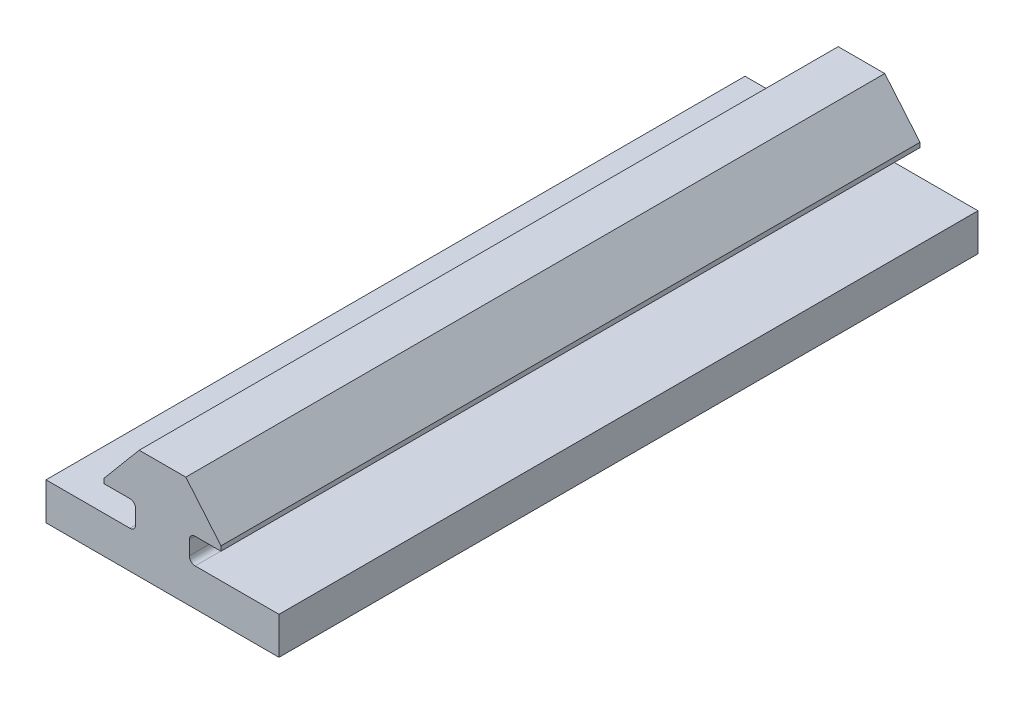
ISO-10303-21;
HEADER;
FILE_DESCRIPTION(('STEP AP214'),'2;1');
FILE_NAME('part.step','',(''),(''),'','','');
FILE_SCHEMA(('AUTOMOTIVE_DESIGN { 1 0 10303 214 1 1 1 1 }'));
ENDSEC;
DATA;
#1=APPLICATION_CONTEXT('core data for automotive mechanical design processes');
#2=APPLICATION_PROTOCOL_DEFINITION('international standard','automotive_design',2000,#1);
#3=PRODUCT_CONTEXT('',#1,'mechanical');
#4=PRODUCT('Part','Part','',(#3));
#5=PRODUCT_RELATED_PRODUCT_CATEGORY('part','',(#4));
#6=PRODUCT_DEFINITION_FORMATION('','',#4);
#7=PRODUCT_DEFINITION_CONTEXT('part definition',#1,'design');
#8=PRODUCT_DEFINITION('design','',#6,#7);
#9=PRODUCT_DEFINITION_SHAPE('','',#8);
#10=(LENGTH_UNIT() NAMED_UNIT(*) SI_UNIT(.MILLI.,.METRE.));
#11=(NAMED_UNIT(*) PLANE_ANGLE_UNIT() SI_UNIT($,.RADIAN.));
#12=(NAMED_UNIT(*) SI_UNIT($,.STERADIAN.) SOLID_ANGLE_UNIT());
#13=UNCERTAINTY_MEASURE_WITH_UNIT(LENGTH_MEASURE(1.E-05),#10,'distance_accuracy_value','');
#14=(GEOMETRIC_REPRESENTATION_CONTEXT(3) GLOBAL_UNCERTAINTY_ASSIGNED_CONTEXT((#13)) GLOBAL_UNIT_ASSIGNED_CONTEXT((#10,
#11,#12)) REPRESENTATION_CONTEXT('',''));
#15=CARTESIAN_POINT('',(0.,0.,0.));
#16=DIRECTION('',(0.,0.,1.));
#17=DIRECTION('',(1.,0.,0.));
#18=AXIS2_PLACEMENT_3D('',#15,#16,#17);
#19=CARTESIAN_POINT('',(-12.7,0.,-3759.2));
#20=DIRECTION('',(1.,0.,0.));
#21=DIRECTION('',(0.,0.,-1.));
#22=AXIS2_PLACEMENT_3D('',#19,#20,#21);
#23=PLANE('',#22);
#24=DIRECTION('',(0.,1.,0.));
#25=VECTOR('',#24,1.);
#26=CARTESIAN_POINT('',(-12.7,0.,-3683.));
#27=LINE('',#26,#25);
#28=CARTESIAN_POINT('',(-12.7,0.,-3683.));
#29=VERTEX_POINT('',#28);
#30=CARTESIAN_POINT('',(-12.7,4.064,-3683.));
#31=VERTEX_POINT('',#30);
#32=EDGE_CURVE('E189',#29,#31,#27,.T.);
#33=ORIENTED_EDGE('',*,*,#32,.T.);
#34=DIRECTION('',(0.,0.,1.));
#35=VECTOR('',#34,1.);
#36=CARTESIAN_POINT('',(-12.7,4.064,-3759.2));
#37=LINE('',#36,#35);
#38=CARTESIAN_POINT('',(-12.7,4.064,-3759.2));
#39=VERTEX_POINT('',#38);
#40=EDGE_CURVE('E11',#39,#31,#37,.T.);
#41=ORIENTED_EDGE('',*,*,#40,.F.);
#42=DIRECTION('',(0.,1.,0.));
#43=VECTOR('',#42,1.);
#44=CARTESIAN_POINT('',(-12.7,0.,-3759.2));
#45=LINE('',#44,#43);
#46=CARTESIAN_POINT('',(-12.7,0.,-3759.2));
#47=VERTEX_POINT('',#46);
#48=EDGE_CURVE('E223',#47,#39,#45,.T.);
#49=ORIENTED_EDGE('',*,*,#48,.F.);
#50=DIRECTION('',(0.,0.,1.));
#51=VECTOR('',#50,1.);
#52=CARTESIAN_POINT('',(-12.7,0.,-3759.2));
#53=LINE('',#52,#51);
#54=EDGE_CURVE('E185',#47,#29,#53,.T.);
#55=ORIENTED_EDGE('',*,*,#54,.T.);
#56=EDGE_LOOP('',(#33,#41,#49,#55));
#57=FACE_BOUND('',#56,.T.);
#58=ADVANCED_FACE('F33',(#57),#23,.F.);
#59=CARTESIAN_POINT('',(-12.7,4.064,-3759.2));
#60=DIRECTION('',(0.,-1.,0.));
#61=DIRECTION('',(0.,0.,-1.));
#62=AXIS2_PLACEMENT_3D('',#59,#60,#61);
#63=PLANE('',#62);
#64=DIRECTION('',(1.,0.,0.));
#65=VECTOR('',#64,1.);
#66=CARTESIAN_POINT('',(-12.7,4.064,-3683.));
#67=LINE('',#66,#65);
#68=CARTESIAN_POINT('',(-3.55599999999985,4.064,-3683.));
#69=VERTEX_POINT('',#68);
#70=EDGE_CURVE('E192',#31,#69,#67,.T.);
#71=ORIENTED_EDGE('',*,*,#70,.T.);
#72=DIRECTION('',(0.,0.,1.));
#73=VECTOR('',#72,1.);
#74=CARTESIAN_POINT('',(-3.55599999999985,4.064,-3759.2));
#75=LINE('',#74,#73);
#76=CARTESIAN_POINT('',(-3.55599999999985,4.064,-3759.2));
#77=VERTEX_POINT('',#76);
#78=EDGE_CURVE('E41',#77,#69,#75,.T.);
#79=ORIENTED_EDGE('',*,*,#78,.F.);
#80=DIRECTION('',(1.,0.,0.));
#81=VECTOR('',#80,1.);
#82=CARTESIAN_POINT('',(-12.7,4.064,-3759.2));
#83=LINE('',#82,#81);
#84=EDGE_CURVE('E122',#39,#77,#83,.T.);
#85=ORIENTED_EDGE('',*,*,#84,.F.);
#86=ORIENTED_EDGE('',*,*,#40,.T.);
#87=EDGE_LOOP('',(#71,#79,#85,#86));
#88=FACE_BOUND('',#87,.T.);
#89=ADVANCED_FACE('F331',(#88),#63,.F.);
#90=CARTESIAN_POINT('',(-3.55599999999985,4.69899999999985,-3759.2));
#91=DIRECTION('',(0.,0.,1.));
#92=DIRECTION('',(1.,0.,0.));
#93=AXIS2_PLACEMENT_3D('',#90,#91,#92);
#94=CYLINDRICAL_SURFACE('',#93,0.634999999999851);
#95=CARTESIAN_POINT('',(-3.55599999999985,4.69899999999985,-3683.));
#96=DIRECTION('',(0.,0.,1.));
#97=DIRECTION('',(1.,0.,0.));
#98=AXIS2_PLACEMENT_3D('',#95,#96,#97);
#99=CIRCLE('',#98,0.634999999999851);
#100=CARTESIAN_POINT('',(-2.921,4.69899999999985,-3683.));
#101=VERTEX_POINT('',#100);
#102=EDGE_CURVE('E194',#69,#101,#99,.T.);
#103=ORIENTED_EDGE('',*,*,#102,.T.);
#104=DIRECTION('',(0.,0.,1.));
#105=VECTOR('',#104,1.);
#106=CARTESIAN_POINT('',(-2.921,4.69899999999985,-3759.2));
#107=LINE('',#106,#105);
#108=CARTESIAN_POINT('',(-2.921,4.69899999999985,-3759.2));
#109=VERTEX_POINT('',#108);
#110=EDGE_CURVE('E260',#109,#101,#107,.T.);
#111=ORIENTED_EDGE('',*,*,#110,.F.);
#112=CARTESIAN_POINT('',(-3.55599999999985,4.69899999999985,-3759.2));
#113=DIRECTION('',(0.,0.,1.));
#114=DIRECTION('',(1.,0.,0.));
#115=AXIS2_PLACEMENT_3D('',#112,#113,#114);
#116=CIRCLE('',#115,0.634999999999851);
#117=EDGE_CURVE('E268',#77,#109,#116,.T.);
#118=ORIENTED_EDGE('',*,*,#117,.F.);
#119=ORIENTED_EDGE('',*,*,#78,.T.);
#120=EDGE_LOOP('',(#103,#111,#118,#119));
#121=FACE_BOUND('',#120,.T.);
#122=ADVANCED_FACE('F266',(#121),#94,.F.);
#123=CARTESIAN_POINT('',(-2.92099999999999,4.69899999999985,-3759.2));
#124=DIRECTION('',(1.,0.,0.));
#125=DIRECTION('',(0.,1.,0.));
#126=AXIS2_PLACEMENT_3D('',#123,#124,#125);
#127=PLANE('',#126);
#128=DIRECTION('',(0.,1.,0.));
#129=VECTOR('',#128,1.);
#130=CARTESIAN_POINT('',(-2.92099999999999,4.69899999999985,-3683.));
#131=LINE('',#130,#129);
#132=CARTESIAN_POINT('',(-2.921,6.22300000000015,-3683.));
#133=VERTEX_POINT('',#132);
#134=EDGE_CURVE('E196',#101,#133,#131,.T.);
#135=ORIENTED_EDGE('',*,*,#134,.T.);
#136=DIRECTION('',(0.,0.,1.));
#137=VECTOR('',#136,1.);
#138=CARTESIAN_POINT('',(-2.921,6.22300000000015,-3759.2));
#139=LINE('',#138,#137);
#140=CARTESIAN_POINT('',(-2.921,6.22300000000015,-3759.2));
#141=VERTEX_POINT('',#140);
#142=EDGE_CURVE('E257',#141,#133,#139,.T.);
#143=ORIENTED_EDGE('',*,*,#142,.F.);
#144=DIRECTION('',(0.,1.,0.));
#145=VECTOR('',#144,1.);
#146=CARTESIAN_POINT('',(-2.92099999999999,4.69899999999985,-3759.2));
#147=LINE('',#146,#145);
#148=EDGE_CURVE('E286',#109,#141,#147,.T.);
#149=ORIENTED_EDGE('',*,*,#148,.F.);
#150=ORIENTED_EDGE('',*,*,#110,.T.);
#151=EDGE_LOOP('',(#135,#143,#149,#150));
#152=FACE_BOUND('',#151,.T.);
#153=ADVANCED_FACE('F277',(#152),#127,.F.);
#154=CARTESIAN_POINT('',(-3.55599999999985,6.22300000000015,-3759.2));
#155=DIRECTION('',(0.,0.,1.));
#156=DIRECTION('',(1.,0.,0.));
#157=AXIS2_PLACEMENT_3D('',#154,#155,#156);
#158=CYLINDRICAL_SURFACE('',#157,0.634999999999851);
#159=CARTESIAN_POINT('',(-3.55599999999985,6.22300000000015,-3683.));
#160=DIRECTION('',(0.,0.,1.));
#161=DIRECTION('',(1.,0.,0.));
#162=AXIS2_PLACEMENT_3D('',#159,#160,#161);
#163=CIRCLE('',#162,0.634999999999851);
#164=CARTESIAN_POINT('',(-3.55599999999985,6.858,-3683.));
#165=VERTEX_POINT('',#164);
#166=EDGE_CURVE('E198',#133,#165,#163,.T.);
#167=ORIENTED_EDGE('',*,*,#166,.T.);
#168=DIRECTION('',(0.,0.,1.));
#169=VECTOR('',#168,1.);
#170=CARTESIAN_POINT('',(-3.55599999999985,6.858,-3759.2));
#171=LINE('',#170,#169);
#172=CARTESIAN_POINT('',(-3.55599999999985,6.858,-3759.2));
#173=VERTEX_POINT('',#172);
#174=EDGE_CURVE('E254',#173,#165,#171,.T.);
#175=ORIENTED_EDGE('',*,*,#174,.F.);
#176=CARTESIAN_POINT('',(-3.55599999999985,6.22300000000015,-3759.2));
#177=DIRECTION('',(0.,0.,1.));
#178=DIRECTION('',(1.,0.,0.));
#179=AXIS2_PLACEMENT_3D('',#176,#177,#178);
#180=CIRCLE('',#179,0.634999999999851);
#181=EDGE_CURVE('E283',#141,#173,#180,.T.);
#182=ORIENTED_EDGE('',*,*,#181,.F.);
#183=ORIENTED_EDGE('',*,*,#142,.T.);
#184=EDGE_LOOP('',(#167,#175,#182,#183));
#185=FACE_BOUND('',#184,.T.);
#186=ADVANCED_FACE('F281',(#185),#158,.F.);
#187=CARTESIAN_POINT('',(-3.55599999999985,6.85800000000001,-3759.2));
#188=DIRECTION('',(0.,1.,0.));
#189=DIRECTION('',(-1.,0.,0.));
#190=AXIS2_PLACEMENT_3D('',#187,#188,#189);
#191=PLANE('',#190);
#192=DIRECTION('',(-1.,0.,0.));
#193=VECTOR('',#192,1.);
#194=CARTESIAN_POINT('',(-3.55599999999985,6.85800000000001,-3683.));
#195=LINE('',#194,#193);
#196=CARTESIAN_POINT('',(-6.376363549,6.858,-3683.));
#197=VERTEX_POINT('',#196);
#198=EDGE_CURVE('E200',#165,#197,#195,.T.);
#199=ORIENTED_EDGE('',*,*,#198,.T.);
#200=DIRECTION('',(0.,0.,1.));
#201=VECTOR('',#200,1.);
#202=CARTESIAN_POINT('',(-6.376363549,6.858,-3759.2));
#203=LINE('',#202,#201);
#204=CARTESIAN_POINT('',(-6.376363549,6.858,-3759.2));
#205=VERTEX_POINT('',#204);
#206=EDGE_CURVE('E251',#205,#197,#203,.T.);
#207=ORIENTED_EDGE('',*,*,#206,.F.);
#208=DIRECTION('',(-1.,0.,0.));
#209=VECTOR('',#208,1.);
#210=CARTESIAN_POINT('',(-3.55599999999985,6.85800000000001,-3759.2));
#211=LINE('',#210,#209);
#212=EDGE_CURVE('E285',#173,#205,#211,.T.);
#213=ORIENTED_EDGE('',*,*,#212,.F.);
#214=ORIENTED_EDGE('',*,*,#174,.T.);
#215=EDGE_LOOP('',(#199,#207,#213,#214));
#216=FACE_BOUND('',#215,.T.);
#217=ADVANCED_FACE('F344',(#216),#191,.F.);
#218=CARTESIAN_POINT('',(-6.376363549,6.858,-3759.2));
#219=DIRECTION('',(1.,0.,0.));
#220=DIRECTION('',(0.,0.,-1.));
#221=AXIS2_PLACEMENT_3D('',#218,#219,#220);
#222=PLANE('',#221);
#223=DIRECTION('',(0.,1.,0.));
#224=VECTOR('',#223,1.);
#225=CARTESIAN_POINT('',(-6.376363549,6.858,-3683.));
#226=LINE('',#225,#224);
#227=CARTESIAN_POINT('',(-6.376363549,7.36599995798179,-3683.));
#228=VERTEX_POINT('',#227);
#229=EDGE_CURVE('E202',#197,#228,#226,.T.);
#230=ORIENTED_EDGE('',*,*,#229,.T.);
#231=DIRECTION('',(0.,0.,1.));
#232=VECTOR('',#231,1.);
#233=CARTESIAN_POINT('',(-6.376363549,7.36599995798179,-3759.2));
#234=LINE('',#233,#232);
#235=CARTESIAN_POINT('',(-6.376363549,7.36599995798179,-3759.2));
#236=VERTEX_POINT('',#235);
#237=EDGE_CURVE('E248',#236,#228,#234,.T.);
#238=ORIENTED_EDGE('',*,*,#237,.F.);
#239=DIRECTION('',(0.,1.,0.));
#240=VECTOR('',#239,1.);
#241=CARTESIAN_POINT('',(-6.376363549,6.858,-3759.2));
#242=LINE('',#241,#240);
#243=EDGE_CURVE('E288',#205,#236,#242,.T.);
#244=ORIENTED_EDGE('',*,*,#243,.F.);
#245=ORIENTED_EDGE('',*,*,#206,.T.);
#246=EDGE_LOOP('',(#230,#238,#244,#245));
#247=FACE_BOUND('',#246,.T.);
#248=ADVANCED_FACE('F347',(#247),#222,.F.);
#249=CARTESIAN_POINT('',(-6.376363549,7.36599995798179,-3759.2));
#250=DIRECTION('',(0.766044443118977,-0.642787609686541,0.));
#251=DIRECTION('',(0.642787609686541,0.766044443118977,0.));
#252=AXIS2_PLACEMENT_3D('',#249,#250,#251);
#253=PLANE('',#252);
#254=DIRECTION('',(0.642787609686541,0.766044443118977,0.));
#255=VECTOR('',#254,1.);
#256=CARTESIAN_POINT('',(-6.376363549,7.36599995798179,-3683.));
#257=LINE('',#256,#255);
#258=CARTESIAN_POINT('',(-2.54,11.938,-3683.));
#259=VERTEX_POINT('',#258);
#260=EDGE_CURVE('E204',#228,#259,#257,.T.);
#261=ORIENTED_EDGE('',*,*,#260,.T.);
#262=DIRECTION('',(0.,0.,1.));
#263=VECTOR('',#262,1.);
#264=CARTESIAN_POINT('',(-2.54,11.938,-3759.2));
#265=LINE('',#264,#263);
#266=CARTESIAN_POINT('',(-2.54,11.938,-3759.2));
#267=VERTEX_POINT('',#266);
#268=EDGE_CURVE('E245',#267,#259,#265,.T.);
#269=ORIENTED_EDGE('',*,*,#268,.F.);
#270=DIRECTION('',(0.642787609686541,0.766044443118977,0.));
#271=VECTOR('',#270,1.);
#272=CARTESIAN_POINT('',(-6.376363549,7.36599995798179,-3759.2));
#273=LINE('',#272,#271);
#274=EDGE_CURVE('E294',#236,#267,#273,.T.);
#275=ORIENTED_EDGE('',*,*,#274,.F.);
#276=ORIENTED_EDGE('',*,*,#237,.T.);
#277=EDGE_LOOP('',(#261,#269,#275,#276));
#278=FACE_BOUND('',#277,.T.);
#279=ADVANCED_FACE('F351',(#278),#253,.F.);
#280=CARTESIAN_POINT('',(-2.54,11.938,-3759.2));
#281=DIRECTION('',(0.,-1.,0.));
#282=DIRECTION('',(0.,0.,-1.));
#283=AXIS2_PLACEMENT_3D('',#280,#281,#282);
#284=PLANE('',#283);
#285=DIRECTION('',(1.,0.,0.));
#286=VECTOR('',#285,1.);
#287=CARTESIAN_POINT('',(-2.54,11.938,-3683.));
#288=LINE('',#287,#286);
#289=CARTESIAN_POINT('',(2.54,11.938,-3683.));
#290=VERTEX_POINT('',#289);
#291=EDGE_CURVE('E206',#259,#290,#288,.T.);
#292=ORIENTED_EDGE('',*,*,#291,.T.);
#293=DIRECTION('',(0.,0.,1.));
#294=VECTOR('',#293,1.);
#295=CARTESIAN_POINT('',(2.54,11.938,-3759.2));
#296=LINE('',#295,#294);
#297=CARTESIAN_POINT('',(2.54,11.938,-3759.2));
#298=VERTEX_POINT('',#297);
#299=EDGE_CURVE('E242',#298,#290,#296,.T.);
#300=ORIENTED_EDGE('',*,*,#299,.F.);
#301=DIRECTION('',(1.,0.,0.));
#302=VECTOR('',#301,1.);
#303=CARTESIAN_POINT('',(-2.54,11.938,-3759.2));
#304=LINE('',#303,#302);
#305=EDGE_CURVE('E296',#267,#298,#304,.T.);
#306=ORIENTED_EDGE('',*,*,#305,.F.);
#307=ORIENTED_EDGE('',*,*,#268,.T.);
#308=EDGE_LOOP('',(#292,#300,#306,#307));
#309=FACE_BOUND('',#308,.T.);
#310=ADVANCED_FACE('F355',(#309),#284,.F.);
#311=CARTESIAN_POINT('',(2.54,11.938,-3759.2));
#312=DIRECTION('',(-0.766044443118977,-0.642787609686541,0.));
#313=DIRECTION('',(0.642787609686541,-0.766044443118977,0.));
#314=AXIS2_PLACEMENT_3D('',#311,#312,#313);
#315=PLANE('',#314);
#316=DIRECTION('',(0.642787609686541,-0.766044443118977,0.));
#317=VECTOR('',#316,1.);
#318=CARTESIAN_POINT('',(2.54,11.938,-3683.));
#319=LINE('',#318,#317);
#320=CARTESIAN_POINT('',(6.376363549,7.36599995798179,-3683.));
#321=VERTEX_POINT('',#320);
#322=EDGE_CURVE('E208',#290,#321,#319,.T.);
#323=ORIENTED_EDGE('',*,*,#322,.T.);
#324=DIRECTION('',(0.,0.,1.));
#325=VECTOR('',#324,1.);
#326=CARTESIAN_POINT('',(6.376363549,7.36599995798179,-3759.2));
#327=LINE('',#326,#325);
#328=CARTESIAN_POINT('',(6.376363549,7.36599995798179,-3759.2));
#329=VERTEX_POINT('',#328);
#330=EDGE_CURVE('E239',#329,#321,#327,.T.);
#331=ORIENTED_EDGE('',*,*,#330,.F.);
#332=DIRECTION('',(0.642787609686541,-0.766044443118977,0.));
#333=VECTOR('',#332,1.);
#334=CARTESIAN_POINT('',(2.54,11.938,-3759.2));
#335=LINE('',#334,#333);
#336=EDGE_CURVE('E298',#298,#329,#335,.T.);
#337=ORIENTED_EDGE('',*,*,#336,.F.);
#338=ORIENTED_EDGE('',*,*,#299,.T.);
#339=EDGE_LOOP('',(#323,#331,#337,#338));
#340=FACE_BOUND('',#339,.T.);
#341=ADVANCED_FACE('F359',(#340),#315,.F.);
#342=CARTESIAN_POINT('',(6.376363549,7.36599995798179,-3759.2));
#343=DIRECTION('',(-1.,0.,0.));
#344=DIRECTION('',(0.,0.,1.));
#345=AXIS2_PLACEMENT_3D('',#342,#343,#344);
#346=PLANE('',#345);
#347=DIRECTION('',(0.,-1.,0.));
#348=VECTOR('',#347,1.);
#349=CARTESIAN_POINT('',(6.376363549,7.36599995798179,-3683.));
#350=LINE('',#349,#348);
#351=CARTESIAN_POINT('',(6.376363549,6.858,-3683.));
#352=VERTEX_POINT('',#351);
#353=EDGE_CURVE('E210',#321,#352,#350,.T.);
#354=ORIENTED_EDGE('',*,*,#353,.T.);
#355=DIRECTION('',(0.,0.,1.));
#356=VECTOR('',#355,1.);
#357=CARTESIAN_POINT('',(6.376363549,6.858,-3759.2));
#358=LINE('',#357,#356);
#359=CARTESIAN_POINT('',(6.376363549,6.858,-3759.2));
#360=VERTEX_POINT('',#359);
#361=EDGE_CURVE('E236',#360,#352,#358,.T.);
#362=ORIENTED_EDGE('',*,*,#361,.F.);
#363=DIRECTION('',(0.,-1.,0.));
#364=VECTOR('',#363,1.);
#365=CARTESIAN_POINT('',(6.376363549,7.36599995798179,-3759.2));
#366=LINE('',#365,#364);
#367=EDGE_CURVE('E300',#329,#360,#366,.T.);
#368=ORIENTED_EDGE('',*,*,#367,.F.);
#369=ORIENTED_EDGE('',*,*,#330,.T.);
#370=EDGE_LOOP('',(#354,#362,#368,#369));
#371=FACE_BOUND('',#370,.T.);
#372=ADVANCED_FACE('F363',(#371),#346,.F.);
#373=CARTESIAN_POINT('',(6.376363549,6.858,-3759.2));
#374=DIRECTION('',(0.,1.,0.));
#375=DIRECTION('',(0.,0.,1.));
#376=AXIS2_PLACEMENT_3D('',#373,#374,#375);
#377=PLANE('',#376);
#378=DIRECTION('',(-1.,0.,0.));
#379=VECTOR('',#378,1.);
#380=CARTESIAN_POINT('',(6.376363549,6.858,-3683.));
#381=LINE('',#380,#379);
#382=CARTESIAN_POINT('',(3.55599999999985,6.858,-3683.));
#383=VERTEX_POINT('',#382);
#384=EDGE_CURVE('E212',#352,#383,#381,.T.);
#385=ORIENTED_EDGE('',*,*,#384,.T.);
#386=DIRECTION('',(0.,0.,1.));
#387=VECTOR('',#386,1.);
#388=CARTESIAN_POINT('',(3.55599999999985,6.858,-3759.2));
#389=LINE('',#388,#387);
#390=CARTESIAN_POINT('',(3.55599999999985,6.858,-3759.2));
#391=VERTEX_POINT('',#390);
#392=EDGE_CURVE('E233',#391,#383,#389,.T.);
#393=ORIENTED_EDGE('',*,*,#392,.F.);
#394=DIRECTION('',(-1.,0.,0.));
#395=VECTOR('',#394,1.);
#396=CARTESIAN_POINT('',(6.376363549,6.858,-3759.2));
#397=LINE('',#396,#395);
#398=EDGE_CURVE('E302',#360,#391,#397,.T.);
#399=ORIENTED_EDGE('',*,*,#398,.F.);
#400=ORIENTED_EDGE('',*,*,#361,.T.);
#401=EDGE_LOOP('',(#385,#393,#399,#400));
#402=FACE_BOUND('',#401,.T.);
#403=ADVANCED_FACE('F367',(#402),#377,.F.);
#404=CARTESIAN_POINT('',(3.55599999999985,6.22300000000015,-3759.2));
#405=DIRECTION('',(0.,0.,1.));
#406=DIRECTION('',(1.,0.,0.));
#407=AXIS2_PLACEMENT_3D('',#404,#405,#406);
#408=CYLINDRICAL_SURFACE('',#407,0.634999999999851);
#409=CARTESIAN_POINT('',(3.55599999999985,6.22300000000015,-3683.));
#410=DIRECTION('',(0.,0.,1.));
#411=DIRECTION('',(1.,0.,0.));
#412=AXIS2_PLACEMENT_3D('',#409,#410,#411);
#413=CIRCLE('',#412,0.634999999999851);
#414=CARTESIAN_POINT('',(2.921,6.22300000000015,-3683.));
#415=VERTEX_POINT('',#414);
#416=EDGE_CURVE('E214',#383,#415,#413,.T.);
#417=ORIENTED_EDGE('',*,*,#416,.T.);
#418=DIRECTION('',(0.,0.,1.));
#419=VECTOR('',#418,1.);
#420=CARTESIAN_POINT('',(2.921,6.22300000000015,-3759.2));
#421=LINE('',#420,#419);
#422=CARTESIAN_POINT('',(2.921,6.22300000000015,-3759.2));
#423=VERTEX_POINT('',#422);
#424=EDGE_CURVE('E230',#423,#415,#421,.T.);
#425=ORIENTED_EDGE('',*,*,#424,.F.);
#426=CARTESIAN_POINT('',(3.55599999999985,6.22300000000015,-3759.2));
#427=DIRECTION('',(0.,0.,1.));
#428=DIRECTION('',(1.,0.,0.));
#429=AXIS2_PLACEMENT_3D('',#426,#427,#428);
#430=CIRCLE('',#429,0.634999999999851);
#431=EDGE_CURVE('E304',#391,#423,#430,.T.);
#432=ORIENTED_EDGE('',*,*,#431,.F.);
#433=ORIENTED_EDGE('',*,*,#392,.T.);
#434=EDGE_LOOP('',(#417,#425,#432,#433));
#435=FACE_BOUND('',#434,.T.);
#436=ADVANCED_FACE('F371',(#435),#408,.F.);
#437=CARTESIAN_POINT('',(2.92099999999999,6.22300000000015,-3759.2));
#438=DIRECTION('',(-1.,0.,0.));
#439=DIRECTION('',(0.,-1.,0.));
#440=AXIS2_PLACEMENT_3D('',#437,#438,#439);
#441=PLANE('',#440);
#442=DIRECTION('',(0.,-1.,0.));
#443=VECTOR('',#442,1.);
#444=CARTESIAN_POINT('',(2.92099999999999,6.22300000000015,-3683.));
#445=LINE('',#444,#443);
#446=CARTESIAN_POINT('',(2.921,4.69899999999985,-3683.));
#447=VERTEX_POINT('',#446);
#448=EDGE_CURVE('E216',#415,#447,#445,.T.);
#449=ORIENTED_EDGE('',*,*,#448,.T.);
#450=DIRECTION('',(0.,0.,1.));
#451=VECTOR('',#450,1.);
#452=CARTESIAN_POINT('',(2.921,4.69899999999985,-3759.2));
#453=LINE('',#452,#451);
#454=CARTESIAN_POINT('',(2.921,4.69899999999985,-3759.2));
#455=VERTEX_POINT('',#454);
#456=EDGE_CURVE('E227',#455,#447,#453,.T.);
#457=ORIENTED_EDGE('',*,*,#456,.F.);
#458=DIRECTION('',(0.,-1.,0.));
#459=VECTOR('',#458,1.);
#460=CARTESIAN_POINT('',(2.92099999999999,6.22300000000015,-3759.2));
#461=LINE('',#460,#459);
#462=EDGE_CURVE('E306',#423,#455,#461,.T.);
#463=ORIENTED_EDGE('',*,*,#462,.F.);
#464=ORIENTED_EDGE('',*,*,#424,.T.);
#465=EDGE_LOOP('',(#449,#457,#463,#464));
#466=FACE_BOUND('',#465,.T.);
#467=ADVANCED_FACE('F312',(#466),#441,.F.);
#468=CARTESIAN_POINT('',(3.55599999999985,4.69899999999985,-3759.2));
#469=DIRECTION('',(0.,0.,1.));
#470=DIRECTION('',(1.,0.,0.));
#471=AXIS2_PLACEMENT_3D('',#468,#469,#470);
#472=CYLINDRICAL_SURFACE('',#471,0.634999999999851);
#473=CARTESIAN_POINT('',(3.55599999999985,4.69899999999985,-3683.));
#474=DIRECTION('',(0.,0.,1.));
#475=DIRECTION('',(1.,0.,0.));
#476=AXIS2_PLACEMENT_3D('',#473,#474,#475);
#477=CIRCLE('',#476,0.634999999999851);
#478=CARTESIAN_POINT('',(3.55599999999985,4.064,-3683.));
#479=VERTEX_POINT('',#478);
#480=EDGE_CURVE('E218',#447,#479,#477,.T.);
#481=ORIENTED_EDGE('',*,*,#480,.T.);
#482=DIRECTION('',(0.,0.,1.));
#483=VECTOR('',#482,1.);
#484=CARTESIAN_POINT('',(3.55599999999985,4.064,-3759.2));
#485=LINE('',#484,#483);
#486=CARTESIAN_POINT('',(3.55599999999985,4.064,-3759.2));
#487=VERTEX_POINT('',#486);
#488=EDGE_CURVE('E180',#487,#479,#485,.T.);
#489=ORIENTED_EDGE('',*,*,#488,.F.);
#490=CARTESIAN_POINT('',(3.55599999999985,4.69899999999985,-3759.2));
#491=DIRECTION('',(0.,0.,1.));
#492=DIRECTION('',(1.,0.,0.));
#493=AXIS2_PLACEMENT_3D('',#490,#491,#492);
#494=CIRCLE('',#493,0.634999999999851);
#495=EDGE_CURVE('E171',#455,#487,#494,.T.);
#496=ORIENTED_EDGE('',*,*,#495,.F.);
#497=ORIENTED_EDGE('',*,*,#456,.T.);
#498=EDGE_LOOP('',(#481,#489,#496,#497));
#499=FACE_BOUND('',#498,.T.);
#500=ADVANCED_FACE('F316',(#499),#472,.F.);
#501=CARTESIAN_POINT('',(3.55599999999985,4.06399999999999,-3759.2));
#502=DIRECTION('',(0.,-1.,0.));
#503=DIRECTION('',(1.,0.,0.));
#504=AXIS2_PLACEMENT_3D('',#501,#502,#503);
#505=PLANE('',#504);
#506=DIRECTION('',(1.,0.,0.));
#507=VECTOR('',#506,1.);
#508=CARTESIAN_POINT('',(3.55599999999985,4.06399999999999,-3683.));
#509=LINE('',#508,#507);
#510=CARTESIAN_POINT('',(12.7,4.064,-3683.));
#511=VERTEX_POINT('',#510);
#512=EDGE_CURVE('E179',#479,#511,#509,.T.);
#513=ORIENTED_EDGE('',*,*,#512,.T.);
#514=DIRECTION('',(0.,0.,1.));
#515=VECTOR('',#514,1.);
#516=CARTESIAN_POINT('',(12.7,4.064,-3759.2));
#517=LINE('',#516,#515);
#518=CARTESIAN_POINT('',(12.7,4.064,-3759.2));
#519=VERTEX_POINT('',#518);
#520=EDGE_CURVE('E176',#519,#511,#517,.T.);
#521=ORIENTED_EDGE('',*,*,#520,.F.);
#522=DIRECTION('',(1.,0.,0.));
#523=VECTOR('',#522,1.);
#524=CARTESIAN_POINT('',(3.55599999999985,4.06399999999999,-3759.2));
#525=LINE('',#524,#523);
#526=EDGE_CURVE('E165',#487,#519,#525,.T.);
#527=ORIENTED_EDGE('',*,*,#526,.F.);
#528=ORIENTED_EDGE('',*,*,#488,.T.);
#529=EDGE_LOOP('',(#513,#521,#527,#528));
#530=FACE_BOUND('',#529,.T.);
#531=ADVANCED_FACE('F177',(#530),#505,.F.);
#532=CARTESIAN_POINT('',(12.7,4.064,-3759.2));
#533=DIRECTION('',(-1.,0.,0.));
#534=DIRECTION('',(0.,0.,1.));
#535=AXIS2_PLACEMENT_3D('',#532,#533,#534);
#536=PLANE('',#535);
#537=DIRECTION('',(0.,-1.,0.));
#538=VECTOR('',#537,1.);
#539=CARTESIAN_POINT('',(12.7,4.064,-3683.));
#540=LINE('',#539,#538);
#541=CARTESIAN_POINT('',(12.7,0.,-3683.));
#542=VERTEX_POINT('',#541);
#543=EDGE_CURVE('E108',#511,#542,#540,.T.);
#544=ORIENTED_EDGE('',*,*,#543,.T.);
#545=DIRECTION('',(0.,0.,1.));
#546=VECTOR('',#545,1.);
#547=CARTESIAN_POINT('',(12.7,0.,-3759.2));
#548=LINE('',#547,#546);
#549=CARTESIAN_POINT('',(12.7,0.,-3759.2));
#550=VERTEX_POINT('',#549);
#551=EDGE_CURVE('E181',#550,#542,#548,.T.);
#552=ORIENTED_EDGE('',*,*,#551,.F.);
#553=DIRECTION('',(0.,-1.,0.));
#554=VECTOR('',#553,1.);
#555=CARTESIAN_POINT('',(12.7,4.064,-3759.2));
#556=LINE('',#555,#554);
#557=EDGE_CURVE('E169',#519,#550,#556,.T.);
#558=ORIENTED_EDGE('',*,*,#557,.F.);
#559=ORIENTED_EDGE('',*,*,#520,.T.);
#560=EDGE_LOOP('',(#544,#552,#558,#559));
#561=FACE_BOUND('',#560,.T.);
#562=ADVANCED_FACE('F183',(#561),#536,.F.);
#563=CARTESIAN_POINT('',(12.7,0.,-3759.2));
#564=DIRECTION('',(0.,1.,0.));
#565=DIRECTION('',(0.,0.,1.));
#566=AXIS2_PLACEMENT_3D('',#563,#564,#565);
#567=PLANE('',#566);
#568=DIRECTION('',(-1.,0.,0.));
#569=VECTOR('',#568,1.);
#570=CARTESIAN_POINT('',(12.7,0.,-3683.));
#571=LINE('',#570,#569);
#572=EDGE_CURVE('E114',#542,#29,#571,.T.);
#573=ORIENTED_EDGE('',*,*,#572,.T.);
#574=ORIENTED_EDGE('',*,*,#54,.F.);
#575=DIRECTION('',(-1.,0.,0.));
#576=VECTOR('',#575,1.);
#577=CARTESIAN_POINT('',(12.7,0.,-3759.2));
#578=LINE('',#577,#576);
#579=EDGE_CURVE('E49',#550,#47,#578,.T.);
#580=ORIENTED_EDGE('',*,*,#579,.F.);
#581=ORIENTED_EDGE('',*,*,#551,.T.);
#582=EDGE_LOOP('',(#573,#574,#580,#581));
#583=FACE_BOUND('',#582,.T.);
#584=ADVANCED_FACE('F320',(#583),#567,.F.);
#585=CARTESIAN_POINT('',(-3.55599999999985,4.69899999999985,-3759.2));
#586=DIRECTION('',(0.,0.,1.));
#587=DIRECTION('',(1.,0.,0.));
#588=AXIS2_PLACEMENT_3D('',#585,#586,#587);
#589=PLANE('',#588);
#590=ORIENTED_EDGE('',*,*,#48,.T.);
#591=ORIENTED_EDGE('',*,*,#84,.T.);
#592=ORIENTED_EDGE('',*,*,#117,.T.);
#593=ORIENTED_EDGE('',*,*,#148,.T.);
#594=ORIENTED_EDGE('',*,*,#181,.T.);
#595=ORIENTED_EDGE('',*,*,#212,.T.);
#596=ORIENTED_EDGE('',*,*,#243,.T.);
#597=ORIENTED_EDGE('',*,*,#274,.T.);
#598=ORIENTED_EDGE('',*,*,#305,.T.);
#599=ORIENTED_EDGE('',*,*,#336,.T.);
#600=ORIENTED_EDGE('',*,*,#367,.T.);
#601=ORIENTED_EDGE('',*,*,#398,.T.);
#602=ORIENTED_EDGE('',*,*,#431,.T.);
#603=ORIENTED_EDGE('',*,*,#462,.T.);
#604=ORIENTED_EDGE('',*,*,#495,.T.);
#605=ORIENTED_EDGE('',*,*,#526,.T.);
#606=ORIENTED_EDGE('',*,*,#557,.T.);
#607=ORIENTED_EDGE('',*,*,#579,.T.);
#608=EDGE_LOOP('',(#590,#591,#592,#593,#594,#595,#596,#597,#598,#599,#600,#601,#602,#603,#604,
#605,#606,#607));
#609=FACE_BOUND('',#608,.T.);
#610=ADVANCED_FACE('F167',(#609),#589,.F.);
#611=CARTESIAN_POINT('',(-3.55599999999985,4.69899999999985,-3683.));
#612=DIRECTION('',(0.,0.,1.));
#613=DIRECTION('',(1.,0.,0.));
#614=AXIS2_PLACEMENT_3D('',#611,#612,#613);
#615=PLANE('',#614);
#616=ORIENTED_EDGE('',*,*,#32,.F.);
#617=ORIENTED_EDGE('',*,*,#572,.F.);
#618=ORIENTED_EDGE('',*,*,#543,.F.);
#619=ORIENTED_EDGE('',*,*,#512,.F.);
#620=ORIENTED_EDGE('',*,*,#480,.F.);
#621=ORIENTED_EDGE('',*,*,#448,.F.);
#622=ORIENTED_EDGE('',*,*,#416,.F.);
#623=ORIENTED_EDGE('',*,*,#384,.F.);
#624=ORIENTED_EDGE('',*,*,#353,.F.);
#625=ORIENTED_EDGE('',*,*,#322,.F.);
#626=ORIENTED_EDGE('',*,*,#291,.F.);
#627=ORIENTED_EDGE('',*,*,#260,.F.);
#628=ORIENTED_EDGE('',*,*,#229,.F.);
#629=ORIENTED_EDGE('',*,*,#198,.F.);
#630=ORIENTED_EDGE('',*,*,#166,.F.);
#631=ORIENTED_EDGE('',*,*,#134,.F.);
#632=ORIENTED_EDGE('',*,*,#102,.F.);
#633=ORIENTED_EDGE('',*,*,#70,.F.);
#634=EDGE_LOOP('',(#616,#617,#618,#619,#620,#621,#622,#623,#624,#625,#626,#627,#628,#629,#630,
#631,#632,#633));
#635=FACE_BOUND('',#634,.T.);
#636=ADVANCED_FACE('F272',(#635),#615,.T.);
#637=CLOSED_SHELL('',(#58,#89,#122,#153,#186,#217,#248,#279,#310,#341,#372,#403,#436,#467,#500,
#531,#562,#584,#610,#636));
#638=MANIFOLD_SOLID_BREP('B2',#637);
#639=ADVANCED_BREP_SHAPE_REPRESENTATION('',(#18,#638),#14);
#640=SHAPE_DEFINITION_REPRESENTATION(#9,#639);
ENDSEC;
END-ISO-10303-21;
